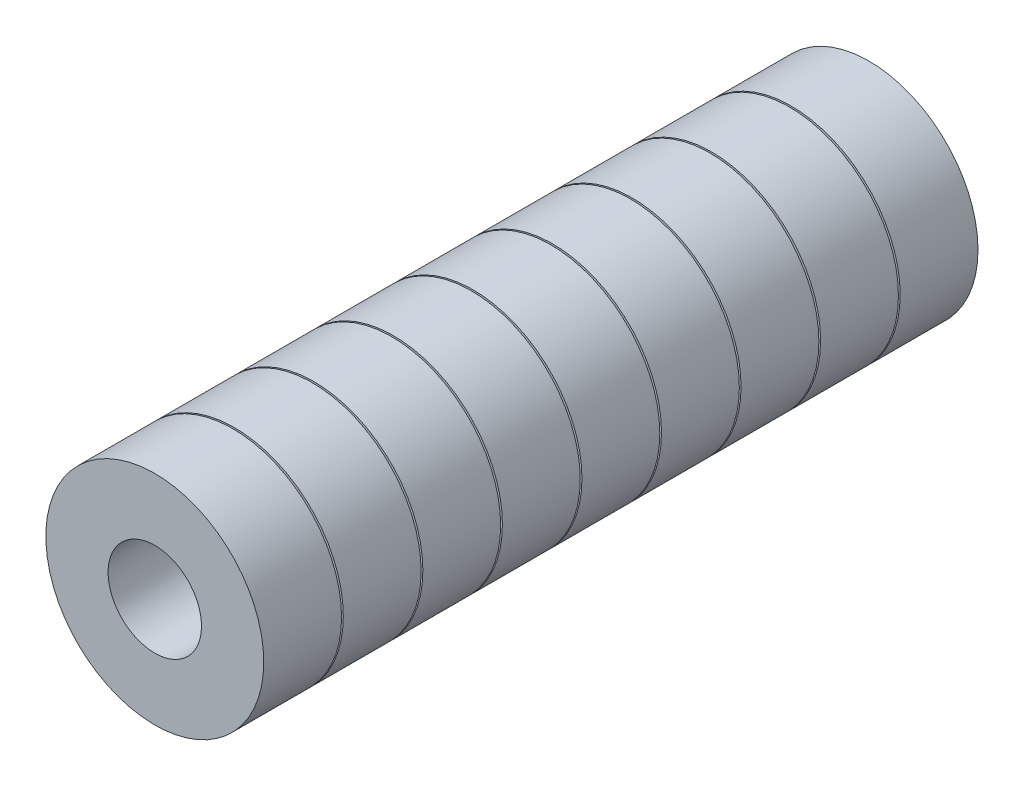
ISO-10303-21;
HEADER;
FILE_DESCRIPTION(('STEP AP214'),'2;1');
FILE_NAME('part.step','',(''),(''),'','','');
FILE_SCHEMA(('AUTOMOTIVE_DESIGN { 1 0 10303 214 1 1 1 1 }'));
ENDSEC;
DATA;
#1=APPLICATION_CONTEXT('core data for automotive mechanical design processes');
#2=APPLICATION_PROTOCOL_DEFINITION('international standard','automotive_design',2000,#1);
#3=PRODUCT_CONTEXT('',#1,'mechanical');
#4=PRODUCT('Part','Part','',(#3));
#5=PRODUCT_RELATED_PRODUCT_CATEGORY('part','',(#4));
#6=PRODUCT_DEFINITION_FORMATION('','',#4);
#7=PRODUCT_DEFINITION_CONTEXT('part definition',#1,'design');
#8=PRODUCT_DEFINITION('design','',#6,#7);
#9=PRODUCT_DEFINITION_SHAPE('','',#8);
#10=(LENGTH_UNIT() NAMED_UNIT(*) SI_UNIT(.MILLI.,.METRE.));
#11=(NAMED_UNIT(*) PLANE_ANGLE_UNIT() SI_UNIT($,.RADIAN.));
#12=(NAMED_UNIT(*) SI_UNIT($,.STERADIAN.) SOLID_ANGLE_UNIT());
#13=UNCERTAINTY_MEASURE_WITH_UNIT(LENGTH_MEASURE(1.E-05),#10,'distance_accuracy_value','');
#14=(GEOMETRIC_REPRESENTATION_CONTEXT(3) GLOBAL_UNCERTAINTY_ASSIGNED_CONTEXT((#13)) GLOBAL_UNIT_ASSIGNED_CONTEXT((#10,
#11,#12)) REPRESENTATION_CONTEXT('',''));
#15=CARTESIAN_POINT('',(0.,0.,0.));
#16=DIRECTION('',(0.,0.,1.));
#17=DIRECTION('',(1.,0.,0.));
#18=AXIS2_PLACEMENT_3D('',#15,#16,#17);
#19=CARTESIAN_POINT('',(0.,0.,-17.9444444444444));
#20=DIRECTION('',(0.,0.,1.));
#21=DIRECTION('',(1.,0.,0.));
#22=AXIS2_PLACEMENT_3D('',#19,#20,#21);
#23=PLANE('',#22);
#24=CARTESIAN_POINT('',(0.,0.,-17.9444444444444));
#25=DIRECTION('',(0.,0.,1.));
#26=DIRECTION('',(1.,0.,0.));
#27=AXIS2_PLACEMENT_3D('',#24,#25,#26);
#28=CIRCLE('',#27,3.5);
#29=CARTESIAN_POINT('',(3.5,0.,-17.9444444444444));
#30=VERTEX_POINT('',#29);
#31=EDGE_CURVE('E11',#30,#30,#28,.T.);
#32=ORIENTED_EDGE('',*,*,#31,.T.);
#33=EDGE_LOOP('',(#32));
#34=FACE_BOUND('',#33,.T.);
#35=CARTESIAN_POINT('',(0.,0.,-17.9444444444444));
#36=DIRECTION('',(0.,0.,1.));
#37=DIRECTION('',(1.,0.,0.));
#38=AXIS2_PLACEMENT_3D('',#35,#36,#37);
#39=CIRCLE('',#38,1.5);
#40=CARTESIAN_POINT('',(1.5,0.,-17.9444444444444));
#41=VERTEX_POINT('',#40);
#42=EDGE_CURVE('E59',#41,#41,#39,.T.);
#43=ORIENTED_EDGE('',*,*,#42,.F.);
#44=EDGE_LOOP('',(#43));
#45=FACE_BOUND('',#44,.T.);
#46=ADVANCED_FACE('F48',(#34,#45),#23,.T.);
#47=CARTESIAN_POINT('',(0.,0.,-20.4444444444444));
#48=DIRECTION('',(0.,0.,1.));
#49=DIRECTION('',(1.,0.,0.));
#50=AXIS2_PLACEMENT_3D('',#47,#48,#49);
#51=PLANE('',#50);
#52=CARTESIAN_POINT('',(0.,0.,-20.4444444444444));
#53=DIRECTION('',(0.,0.,1.));
#54=DIRECTION('',(1.,0.,0.));
#55=AXIS2_PLACEMENT_3D('',#52,#53,#54);
#56=CIRCLE('',#55,3.5);
#57=CARTESIAN_POINT('',(3.5,0.,-20.4444444444444));
#58=VERTEX_POINT('',#57);
#59=EDGE_CURVE('E52',#58,#58,#56,.T.);
#60=ORIENTED_EDGE('',*,*,#59,.F.);
#61=EDGE_LOOP('',(#60));
#62=FACE_BOUND('',#61,.T.);
#63=CARTESIAN_POINT('',(0.,0.,-20.4444444444444));
#64=DIRECTION('',(0.,0.,1.));
#65=DIRECTION('',(1.,0.,0.));
#66=AXIS2_PLACEMENT_3D('',#63,#64,#65);
#67=CIRCLE('',#66,1.5);
#68=CARTESIAN_POINT('',(1.5,0.,-20.4444444444444));
#69=VERTEX_POINT('',#68);
#70=EDGE_CURVE('E61',#69,#69,#67,.T.);
#71=ORIENTED_EDGE('',*,*,#70,.T.);
#72=EDGE_LOOP('',(#71));
#73=FACE_BOUND('',#72,.T.);
#74=ADVANCED_FACE('F71',(#62,#73),#51,.F.);
#75=CARTESIAN_POINT('',(0.,0.,-17.9444444444444));
#76=DIRECTION('',(0.,0.,-1.));
#77=DIRECTION('',(-1.,0.,0.));
#78=AXIS2_PLACEMENT_3D('',#75,#76,#77);
#79=CYLINDRICAL_SURFACE('',#78,3.5);
#80=ORIENTED_EDGE('',*,*,#31,.F.);
#81=EDGE_LOOP('',(#80));
#82=FACE_BOUND('',#81,.T.);
#83=ORIENTED_EDGE('',*,*,#59,.T.);
#84=EDGE_LOOP('',(#83));
#85=FACE_BOUND('',#84,.T.);
#86=ADVANCED_FACE('F50',(#82,#85),#79,.T.);
#87=CARTESIAN_POINT('',(0.,0.,-17.9444444444444));
#88=DIRECTION('',(0.,0.,-1.));
#89=DIRECTION('',(-1.,0.,0.));
#90=AXIS2_PLACEMENT_3D('',#87,#88,#89);
#91=CYLINDRICAL_SURFACE('',#90,1.5);
#92=ORIENTED_EDGE('',*,*,#42,.T.);
#93=EDGE_LOOP('',(#92));
#94=FACE_BOUND('',#93,.T.);
#95=ORIENTED_EDGE('',*,*,#70,.F.);
#96=EDGE_LOOP('',(#95));
#97=FACE_BOUND('',#96,.T.);
#98=ADVANCED_FACE('F67',(#94,#97),#91,.F.);
#99=CLOSED_SHELL('',(#46,#74,#86,#98));
#100=MANIFOLD_SOLID_BREP('B2',#99);
#101=CARTESIAN_POINT('',(0.,0.,-15.3888888888889));
#102=DIRECTION('',(0.,0.,1.));
#103=DIRECTION('',(1.,0.,0.));
#104=AXIS2_PLACEMENT_3D('',#101,#102,#103);
#105=PLANE('',#104);
#106=CARTESIAN_POINT('',(0.,0.,-15.3888888888889));
#107=DIRECTION('',(0.,0.,1.));
#108=DIRECTION('',(1.,0.,0.));
#109=AXIS2_PLACEMENT_3D('',#106,#107,#108);
#110=CIRCLE('',#109,3.5);
#111=CARTESIAN_POINT('',(3.5,0.,-15.3888888888889));
#112=VERTEX_POINT('',#111);
#113=EDGE_CURVE('E47',#112,#112,#110,.T.);
#114=ORIENTED_EDGE('',*,*,#113,.T.);
#115=EDGE_LOOP('',(#114));
#116=FACE_BOUND('',#115,.T.);
#117=CARTESIAN_POINT('',(0.,0.,-15.3888888888889));
#118=DIRECTION('',(0.,0.,1.));
#119=DIRECTION('',(1.,0.,0.));
#120=AXIS2_PLACEMENT_3D('',#117,#118,#119);
#121=CIRCLE('',#120,1.5);
#122=CARTESIAN_POINT('',(1.5,0.,-15.3888888888889));
#123=VERTEX_POINT('',#122);
#124=EDGE_CURVE('E129',#123,#123,#121,.T.);
#125=ORIENTED_EDGE('',*,*,#124,.F.);
#126=EDGE_LOOP('',(#125));
#127=FACE_BOUND('',#126,.T.);
#128=ADVANCED_FACE('F118',(#116,#127),#105,.T.);
#129=CARTESIAN_POINT('',(0.,0.,-17.8888888888889));
#130=DIRECTION('',(0.,0.,1.));
#131=DIRECTION('',(1.,0.,0.));
#132=AXIS2_PLACEMENT_3D('',#129,#130,#131);
#133=PLANE('',#132);
#134=CARTESIAN_POINT('',(0.,0.,-17.8888888888889));
#135=DIRECTION('',(0.,0.,1.));
#136=DIRECTION('',(1.,0.,0.));
#137=AXIS2_PLACEMENT_3D('',#134,#135,#136);
#138=CIRCLE('',#137,3.5);
#139=CARTESIAN_POINT('',(3.5,0.,-17.8888888888889));
#140=VERTEX_POINT('',#139);
#141=EDGE_CURVE('E122',#140,#140,#138,.T.);
#142=ORIENTED_EDGE('',*,*,#141,.F.);
#143=EDGE_LOOP('',(#142));
#144=FACE_BOUND('',#143,.T.);
#145=CARTESIAN_POINT('',(0.,0.,-17.8888888888889));
#146=DIRECTION('',(0.,0.,1.));
#147=DIRECTION('',(1.,0.,0.));
#148=AXIS2_PLACEMENT_3D('',#145,#146,#147);
#149=CIRCLE('',#148,1.5);
#150=CARTESIAN_POINT('',(1.5,0.,-17.8888888888889));
#151=VERTEX_POINT('',#150);
#152=EDGE_CURVE('E131',#151,#151,#149,.T.);
#153=ORIENTED_EDGE('',*,*,#152,.T.);
#154=EDGE_LOOP('',(#153));
#155=FACE_BOUND('',#154,.T.);
#156=ADVANCED_FACE('F141',(#144,#155),#133,.F.);
#157=CARTESIAN_POINT('',(0.,0.,-15.3888888888889));
#158=DIRECTION('',(0.,0.,-1.));
#159=DIRECTION('',(-1.,0.,0.));
#160=AXIS2_PLACEMENT_3D('',#157,#158,#159);
#161=CYLINDRICAL_SURFACE('',#160,3.5);
#162=ORIENTED_EDGE('',*,*,#113,.F.);
#163=EDGE_LOOP('',(#162));
#164=FACE_BOUND('',#163,.T.);
#165=ORIENTED_EDGE('',*,*,#141,.T.);
#166=EDGE_LOOP('',(#165));
#167=FACE_BOUND('',#166,.T.);
#168=ADVANCED_FACE('F120',(#164,#167),#161,.T.);
#169=CARTESIAN_POINT('',(0.,0.,-15.3888888888889));
#170=DIRECTION('',(0.,0.,-1.));
#171=DIRECTION('',(-1.,0.,0.));
#172=AXIS2_PLACEMENT_3D('',#169,#170,#171);
#173=CYLINDRICAL_SURFACE('',#172,1.5);
#174=ORIENTED_EDGE('',*,*,#124,.T.);
#175=EDGE_LOOP('',(#174));
#176=FACE_BOUND('',#175,.T.);
#177=ORIENTED_EDGE('',*,*,#152,.F.);
#178=EDGE_LOOP('',(#177));
#179=FACE_BOUND('',#178,.T.);
#180=ADVANCED_FACE('F137',(#176,#179),#173,.F.);
#181=CLOSED_SHELL('',(#128,#156,#168,#180));
#182=MANIFOLD_SOLID_BREP('B6',#181);
#183=CARTESIAN_POINT('',(0.,0.,-12.8333333333333));
#184=DIRECTION('',(0.,0.,1.));
#185=DIRECTION('',(1.,0.,0.));
#186=AXIS2_PLACEMENT_3D('',#183,#184,#185);
#187=PLANE('',#186);
#188=CARTESIAN_POINT('',(0.,0.,-12.8333333333333));
#189=DIRECTION('',(0.,0.,1.));
#190=DIRECTION('',(1.,0.,0.));
#191=AXIS2_PLACEMENT_3D('',#188,#189,#190);
#192=CIRCLE('',#191,3.5);
#193=CARTESIAN_POINT('',(3.5,0.,-12.8333333333333));
#194=VERTEX_POINT('',#193);
#195=EDGE_CURVE('E117',#194,#194,#192,.T.);
#196=ORIENTED_EDGE('',*,*,#195,.T.);
#197=EDGE_LOOP('',(#196));
#198=FACE_BOUND('',#197,.T.);
#199=CARTESIAN_POINT('',(0.,0.,-12.8333333333333));
#200=DIRECTION('',(0.,0.,1.));
#201=DIRECTION('',(1.,0.,0.));
#202=AXIS2_PLACEMENT_3D('',#199,#200,#201);
#203=CIRCLE('',#202,1.5);
#204=CARTESIAN_POINT('',(1.5,0.,-12.8333333333333));
#205=VERTEX_POINT('',#204);
#206=EDGE_CURVE('E199',#205,#205,#203,.T.);
#207=ORIENTED_EDGE('',*,*,#206,.F.);
#208=EDGE_LOOP('',(#207));
#209=FACE_BOUND('',#208,.T.);
#210=ADVANCED_FACE('F188',(#198,#209),#187,.T.);
#211=CARTESIAN_POINT('',(0.,0.,-15.3333333333333));
#212=DIRECTION('',(0.,0.,1.));
#213=DIRECTION('',(1.,0.,0.));
#214=AXIS2_PLACEMENT_3D('',#211,#212,#213);
#215=PLANE('',#214);
#216=CARTESIAN_POINT('',(0.,0.,-15.3333333333333));
#217=DIRECTION('',(0.,0.,1.));
#218=DIRECTION('',(1.,0.,0.));
#219=AXIS2_PLACEMENT_3D('',#216,#217,#218);
#220=CIRCLE('',#219,3.5);
#221=CARTESIAN_POINT('',(3.5,0.,-15.3333333333333));
#222=VERTEX_POINT('',#221);
#223=EDGE_CURVE('E192',#222,#222,#220,.T.);
#224=ORIENTED_EDGE('',*,*,#223,.F.);
#225=EDGE_LOOP('',(#224));
#226=FACE_BOUND('',#225,.T.);
#227=CARTESIAN_POINT('',(0.,0.,-15.3333333333333));
#228=DIRECTION('',(0.,0.,1.));
#229=DIRECTION('',(1.,0.,0.));
#230=AXIS2_PLACEMENT_3D('',#227,#228,#229);
#231=CIRCLE('',#230,1.5);
#232=CARTESIAN_POINT('',(1.5,0.,-15.3333333333333));
#233=VERTEX_POINT('',#232);
#234=EDGE_CURVE('E201',#233,#233,#231,.T.);
#235=ORIENTED_EDGE('',*,*,#234,.T.);
#236=EDGE_LOOP('',(#235));
#237=FACE_BOUND('',#236,.T.);
#238=ADVANCED_FACE('F211',(#226,#237),#215,.F.);
#239=CARTESIAN_POINT('',(0.,0.,-12.8333333333333));
#240=DIRECTION('',(0.,0.,-1.));
#241=DIRECTION('',(-1.,0.,0.));
#242=AXIS2_PLACEMENT_3D('',#239,#240,#241);
#243=CYLINDRICAL_SURFACE('',#242,3.5);
#244=ORIENTED_EDGE('',*,*,#195,.F.);
#245=EDGE_LOOP('',(#244));
#246=FACE_BOUND('',#245,.T.);
#247=ORIENTED_EDGE('',*,*,#223,.T.);
#248=EDGE_LOOP('',(#247));
#249=FACE_BOUND('',#248,.T.);
#250=ADVANCED_FACE('F190',(#246,#249),#243,.T.);
#251=CARTESIAN_POINT('',(0.,0.,-12.8333333333333));
#252=DIRECTION('',(0.,0.,-1.));
#253=DIRECTION('',(-1.,0.,0.));
#254=AXIS2_PLACEMENT_3D('',#251,#252,#253);
#255=CYLINDRICAL_SURFACE('',#254,1.5);
#256=ORIENTED_EDGE('',*,*,#206,.T.);
#257=EDGE_LOOP('',(#256));
#258=FACE_BOUND('',#257,.T.);
#259=ORIENTED_EDGE('',*,*,#234,.F.);
#260=EDGE_LOOP('',(#259));
#261=FACE_BOUND('',#260,.T.);
#262=ADVANCED_FACE('F207',(#258,#261),#255,.F.);
#263=CLOSED_SHELL('',(#210,#238,#250,#262));
#264=MANIFOLD_SOLID_BREP('B42',#263);
#265=CARTESIAN_POINT('',(0.,0.,-10.2777777777778));
#266=DIRECTION('',(0.,0.,1.));
#267=DIRECTION('',(1.,0.,0.));
#268=AXIS2_PLACEMENT_3D('',#265,#266,#267);
#269=PLANE('',#268);
#270=CARTESIAN_POINT('',(0.,0.,-10.2777777777778));
#271=DIRECTION('',(0.,0.,1.));
#272=DIRECTION('',(1.,0.,0.));
#273=AXIS2_PLACEMENT_3D('',#270,#271,#272);
#274=CIRCLE('',#273,3.5);
#275=CARTESIAN_POINT('',(3.5,0.,-10.2777777777778));
#276=VERTEX_POINT('',#275);
#277=EDGE_CURVE('E187',#276,#276,#274,.T.);
#278=ORIENTED_EDGE('',*,*,#277,.T.);
#279=EDGE_LOOP('',(#278));
#280=FACE_BOUND('',#279,.T.);
#281=CARTESIAN_POINT('',(0.,0.,-10.2777777777778));
#282=DIRECTION('',(0.,0.,1.));
#283=DIRECTION('',(1.,0.,0.));
#284=AXIS2_PLACEMENT_3D('',#281,#282,#283);
#285=CIRCLE('',#284,1.5);
#286=CARTESIAN_POINT('',(1.5,0.,-10.2777777777778));
#287=VERTEX_POINT('',#286);
#288=EDGE_CURVE('E269',#287,#287,#285,.T.);
#289=ORIENTED_EDGE('',*,*,#288,.F.);
#290=EDGE_LOOP('',(#289));
#291=FACE_BOUND('',#290,.T.);
#292=ADVANCED_FACE('F258',(#280,#291),#269,.T.);
#293=CARTESIAN_POINT('',(0.,0.,-12.7777777777778));
#294=DIRECTION('',(0.,0.,1.));
#295=DIRECTION('',(1.,0.,0.));
#296=AXIS2_PLACEMENT_3D('',#293,#294,#295);
#297=PLANE('',#296);
#298=CARTESIAN_POINT('',(0.,0.,-12.7777777777778));
#299=DIRECTION('',(0.,0.,1.));
#300=DIRECTION('',(1.,0.,0.));
#301=AXIS2_PLACEMENT_3D('',#298,#299,#300);
#302=CIRCLE('',#301,3.5);
#303=CARTESIAN_POINT('',(3.5,0.,-12.7777777777778));
#304=VERTEX_POINT('',#303);
#305=EDGE_CURVE('E262',#304,#304,#302,.T.);
#306=ORIENTED_EDGE('',*,*,#305,.F.);
#307=EDGE_LOOP('',(#306));
#308=FACE_BOUND('',#307,.T.);
#309=CARTESIAN_POINT('',(0.,0.,-12.7777777777778));
#310=DIRECTION('',(0.,0.,1.));
#311=DIRECTION('',(1.,0.,0.));
#312=AXIS2_PLACEMENT_3D('',#309,#310,#311);
#313=CIRCLE('',#312,1.5);
#314=CARTESIAN_POINT('',(1.5,0.,-12.7777777777778));
#315=VERTEX_POINT('',#314);
#316=EDGE_CURVE('E271',#315,#315,#313,.T.);
#317=ORIENTED_EDGE('',*,*,#316,.T.);
#318=EDGE_LOOP('',(#317));
#319=FACE_BOUND('',#318,.T.);
#320=ADVANCED_FACE('F281',(#308,#319),#297,.F.);
#321=CARTESIAN_POINT('',(0.,0.,-10.2777777777778));
#322=DIRECTION('',(0.,0.,-1.));
#323=DIRECTION('',(-1.,0.,0.));
#324=AXIS2_PLACEMENT_3D('',#321,#322,#323);
#325=CYLINDRICAL_SURFACE('',#324,3.5);
#326=ORIENTED_EDGE('',*,*,#277,.F.);
#327=EDGE_LOOP('',(#326));
#328=FACE_BOUND('',#327,.T.);
#329=ORIENTED_EDGE('',*,*,#305,.T.);
#330=EDGE_LOOP('',(#329));
#331=FACE_BOUND('',#330,.T.);
#332=ADVANCED_FACE('F260',(#328,#331),#325,.T.);
#333=CARTESIAN_POINT('',(0.,0.,-10.2777777777778));
#334=DIRECTION('',(0.,0.,-1.));
#335=DIRECTION('',(-1.,0.,0.));
#336=AXIS2_PLACEMENT_3D('',#333,#334,#335);
#337=CYLINDRICAL_SURFACE('',#336,1.5);
#338=ORIENTED_EDGE('',*,*,#288,.T.);
#339=EDGE_LOOP('',(#338));
#340=FACE_BOUND('',#339,.T.);
#341=ORIENTED_EDGE('',*,*,#316,.F.);
#342=EDGE_LOOP('',(#341));
#343=FACE_BOUND('',#342,.T.);
#344=ADVANCED_FACE('F277',(#340,#343),#337,.F.);
#345=CLOSED_SHELL('',(#292,#320,#332,#344));
#346=MANIFOLD_SOLID_BREP('B112',#345);
#347=CARTESIAN_POINT('',(0.,0.,-7.72222222222222));
#348=DIRECTION('',(0.,0.,1.));
#349=DIRECTION('',(1.,0.,0.));
#350=AXIS2_PLACEMENT_3D('',#347,#348,#349);
#351=PLANE('',#350);
#352=CARTESIAN_POINT('',(0.,0.,-7.72222222222222));
#353=DIRECTION('',(0.,0.,1.));
#354=DIRECTION('',(1.,0.,0.));
#355=AXIS2_PLACEMENT_3D('',#352,#353,#354);
#356=CIRCLE('',#355,3.5);
#357=CARTESIAN_POINT('',(3.5,0.,-7.72222222222222));
#358=VERTEX_POINT('',#357);
#359=EDGE_CURVE('E257',#358,#358,#356,.T.);
#360=ORIENTED_EDGE('',*,*,#359,.T.);
#361=EDGE_LOOP('',(#360));
#362=FACE_BOUND('',#361,.T.);
#363=CARTESIAN_POINT('',(0.,0.,-7.72222222222222));
#364=DIRECTION('',(0.,0.,1.));
#365=DIRECTION('',(1.,0.,0.));
#366=AXIS2_PLACEMENT_3D('',#363,#364,#365);
#367=CIRCLE('',#366,1.5);
#368=CARTESIAN_POINT('',(1.5,0.,-7.72222222222222));
#369=VERTEX_POINT('',#368);
#370=EDGE_CURVE('E339',#369,#369,#367,.T.);
#371=ORIENTED_EDGE('',*,*,#370,.F.);
#372=EDGE_LOOP('',(#371));
#373=FACE_BOUND('',#372,.T.);
#374=ADVANCED_FACE('F328',(#362,#373),#351,.T.);
#375=CARTESIAN_POINT('',(0.,0.,-10.2222222222222));
#376=DIRECTION('',(0.,0.,1.));
#377=DIRECTION('',(1.,0.,0.));
#378=AXIS2_PLACEMENT_3D('',#375,#376,#377);
#379=PLANE('',#378);
#380=CARTESIAN_POINT('',(0.,0.,-10.2222222222222));
#381=DIRECTION('',(0.,0.,1.));
#382=DIRECTION('',(1.,0.,0.));
#383=AXIS2_PLACEMENT_3D('',#380,#381,#382);
#384=CIRCLE('',#383,3.5);
#385=CARTESIAN_POINT('',(3.5,0.,-10.2222222222222));
#386=VERTEX_POINT('',#385);
#387=EDGE_CURVE('E332',#386,#386,#384,.T.);
#388=ORIENTED_EDGE('',*,*,#387,.F.);
#389=EDGE_LOOP('',(#388));
#390=FACE_BOUND('',#389,.T.);
#391=CARTESIAN_POINT('',(0.,0.,-10.2222222222222));
#392=DIRECTION('',(0.,0.,1.));
#393=DIRECTION('',(1.,0.,0.));
#394=AXIS2_PLACEMENT_3D('',#391,#392,#393);
#395=CIRCLE('',#394,1.5);
#396=CARTESIAN_POINT('',(1.5,0.,-10.2222222222222));
#397=VERTEX_POINT('',#396);
#398=EDGE_CURVE('E341',#397,#397,#395,.T.);
#399=ORIENTED_EDGE('',*,*,#398,.T.);
#400=EDGE_LOOP('',(#399));
#401=FACE_BOUND('',#400,.T.);
#402=ADVANCED_FACE('F351',(#390,#401),#379,.F.);
#403=CARTESIAN_POINT('',(0.,0.,-7.72222222222222));
#404=DIRECTION('',(0.,0.,-1.));
#405=DIRECTION('',(-1.,0.,0.));
#406=AXIS2_PLACEMENT_3D('',#403,#404,#405);
#407=CYLINDRICAL_SURFACE('',#406,3.5);
#408=ORIENTED_EDGE('',*,*,#359,.F.);
#409=EDGE_LOOP('',(#408));
#410=FACE_BOUND('',#409,.T.);
#411=ORIENTED_EDGE('',*,*,#387,.T.);
#412=EDGE_LOOP('',(#411));
#413=FACE_BOUND('',#412,.T.);
#414=ADVANCED_FACE('F330',(#410,#413),#407,.T.);
#415=CARTESIAN_POINT('',(0.,0.,-7.72222222222222));
#416=DIRECTION('',(0.,0.,-1.));
#417=DIRECTION('',(-1.,0.,0.));
#418=AXIS2_PLACEMENT_3D('',#415,#416,#417);
#419=CYLINDRICAL_SURFACE('',#418,1.5);
#420=ORIENTED_EDGE('',*,*,#370,.T.);
#421=EDGE_LOOP('',(#420));
#422=FACE_BOUND('',#421,.T.);
#423=ORIENTED_EDGE('',*,*,#398,.F.);
#424=EDGE_LOOP('',(#423));
#425=FACE_BOUND('',#424,.T.);
#426=ADVANCED_FACE('F347',(#422,#425),#419,.F.);
#427=CLOSED_SHELL('',(#374,#402,#414,#426));
#428=MANIFOLD_SOLID_BREP('B182',#427);
#429=CARTESIAN_POINT('',(0.,0.,-5.16666666666667));
#430=DIRECTION('',(0.,0.,1.));
#431=DIRECTION('',(1.,0.,0.));
#432=AXIS2_PLACEMENT_3D('',#429,#430,#431);
#433=PLANE('',#432);
#434=CARTESIAN_POINT('',(0.,0.,-5.16666666666667));
#435=DIRECTION('',(0.,0.,1.));
#436=DIRECTION('',(1.,0.,0.));
#437=AXIS2_PLACEMENT_3D('',#434,#435,#436);
#438=CIRCLE('',#437,3.5);
#439=CARTESIAN_POINT('',(3.5,0.,-5.16666666666667));
#440=VERTEX_POINT('',#439);
#441=EDGE_CURVE('E327',#440,#440,#438,.T.);
#442=ORIENTED_EDGE('',*,*,#441,.T.);
#443=EDGE_LOOP('',(#442));
#444=FACE_BOUND('',#443,.T.);
#445=CARTESIAN_POINT('',(0.,0.,-5.16666666666667));
#446=DIRECTION('',(0.,0.,1.));
#447=DIRECTION('',(1.,0.,0.));
#448=AXIS2_PLACEMENT_3D('',#445,#446,#447);
#449=CIRCLE('',#448,1.5);
#450=CARTESIAN_POINT('',(1.5,0.,-5.16666666666667));
#451=VERTEX_POINT('',#450);
#452=EDGE_CURVE('E409',#451,#451,#449,.T.);
#453=ORIENTED_EDGE('',*,*,#452,.F.);
#454=EDGE_LOOP('',(#453));
#455=FACE_BOUND('',#454,.T.);
#456=ADVANCED_FACE('F398',(#444,#455),#433,.T.);
#457=CARTESIAN_POINT('',(0.,0.,-7.66666666666667));
#458=DIRECTION('',(0.,0.,1.));
#459=DIRECTION('',(1.,0.,0.));
#460=AXIS2_PLACEMENT_3D('',#457,#458,#459);
#461=PLANE('',#460);
#462=CARTESIAN_POINT('',(0.,0.,-7.66666666666667));
#463=DIRECTION('',(0.,0.,1.));
#464=DIRECTION('',(1.,0.,0.));
#465=AXIS2_PLACEMENT_3D('',#462,#463,#464);
#466=CIRCLE('',#465,3.5);
#467=CARTESIAN_POINT('',(3.5,0.,-7.66666666666667));
#468=VERTEX_POINT('',#467);
#469=EDGE_CURVE('E402',#468,#468,#466,.T.);
#470=ORIENTED_EDGE('',*,*,#469,.F.);
#471=EDGE_LOOP('',(#470));
#472=FACE_BOUND('',#471,.T.);
#473=CARTESIAN_POINT('',(0.,0.,-7.66666666666667));
#474=DIRECTION('',(0.,0.,1.));
#475=DIRECTION('',(1.,0.,0.));
#476=AXIS2_PLACEMENT_3D('',#473,#474,#475);
#477=CIRCLE('',#476,1.5);
#478=CARTESIAN_POINT('',(1.5,0.,-7.66666666666667));
#479=VERTEX_POINT('',#478);
#480=EDGE_CURVE('E411',#479,#479,#477,.T.);
#481=ORIENTED_EDGE('',*,*,#480,.T.);
#482=EDGE_LOOP('',(#481));
#483=FACE_BOUND('',#482,.T.);
#484=ADVANCED_FACE('F421',(#472,#483),#461,.F.);
#485=CARTESIAN_POINT('',(0.,0.,-5.16666666666667));
#486=DIRECTION('',(0.,0.,-1.));
#487=DIRECTION('',(-1.,0.,0.));
#488=AXIS2_PLACEMENT_3D('',#485,#486,#487);
#489=CYLINDRICAL_SURFACE('',#488,3.5);
#490=ORIENTED_EDGE('',*,*,#441,.F.);
#491=EDGE_LOOP('',(#490));
#492=FACE_BOUND('',#491,.T.);
#493=ORIENTED_EDGE('',*,*,#469,.T.);
#494=EDGE_LOOP('',(#493));
#495=FACE_BOUND('',#494,.T.);
#496=ADVANCED_FACE('F400',(#492,#495),#489,.T.);
#497=CARTESIAN_POINT('',(0.,0.,-5.16666666666667));
#498=DIRECTION('',(0.,0.,-1.));
#499=DIRECTION('',(-1.,0.,0.));
#500=AXIS2_PLACEMENT_3D('',#497,#498,#499);
#501=CYLINDRICAL_SURFACE('',#500,1.5);
#502=ORIENTED_EDGE('',*,*,#452,.T.);
#503=EDGE_LOOP('',(#502));
#504=FACE_BOUND('',#503,.T.);
#505=ORIENTED_EDGE('',*,*,#480,.F.);
#506=EDGE_LOOP('',(#505));
#507=FACE_BOUND('',#506,.T.);
#508=ADVANCED_FACE('F417',(#504,#507),#501,.F.);
#509=CLOSED_SHELL('',(#456,#484,#496,#508));
#510=MANIFOLD_SOLID_BREP('B252',#509);
#511=CARTESIAN_POINT('',(0.,0.,-2.61111111111111));
#512=DIRECTION('',(0.,0.,1.));
#513=DIRECTION('',(1.,0.,0.));
#514=AXIS2_PLACEMENT_3D('',#511,#512,#513);
#515=PLANE('',#514);
#516=CARTESIAN_POINT('',(0.,0.,-2.61111111111111));
#517=DIRECTION('',(0.,0.,1.));
#518=DIRECTION('',(1.,0.,0.));
#519=AXIS2_PLACEMENT_3D('',#516,#517,#518);
#520=CIRCLE('',#519,3.5);
#521=CARTESIAN_POINT('',(3.5,0.,-2.61111111111111));
#522=VERTEX_POINT('',#521);
#523=EDGE_CURVE('E397',#522,#522,#520,.T.);
#524=ORIENTED_EDGE('',*,*,#523,.T.);
#525=EDGE_LOOP('',(#524));
#526=FACE_BOUND('',#525,.T.);
#527=CARTESIAN_POINT('',(0.,0.,-2.61111111111111));
#528=DIRECTION('',(0.,0.,1.));
#529=DIRECTION('',(1.,0.,0.));
#530=AXIS2_PLACEMENT_3D('',#527,#528,#529);
#531=CIRCLE('',#530,1.5);
#532=CARTESIAN_POINT('',(1.5,0.,-2.61111111111111));
#533=VERTEX_POINT('',#532);
#534=EDGE_CURVE('E479',#533,#533,#531,.T.);
#535=ORIENTED_EDGE('',*,*,#534,.F.);
#536=EDGE_LOOP('',(#535));
#537=FACE_BOUND('',#536,.T.);
#538=ADVANCED_FACE('F468',(#526,#537),#515,.T.);
#539=CARTESIAN_POINT('',(0.,0.,-5.11111111111111));
#540=DIRECTION('',(0.,0.,1.));
#541=DIRECTION('',(1.,0.,0.));
#542=AXIS2_PLACEMENT_3D('',#539,#540,#541);
#543=PLANE('',#542);
#544=CARTESIAN_POINT('',(0.,0.,-5.11111111111111));
#545=DIRECTION('',(0.,0.,1.));
#546=DIRECTION('',(1.,0.,0.));
#547=AXIS2_PLACEMENT_3D('',#544,#545,#546);
#548=CIRCLE('',#547,3.5);
#549=CARTESIAN_POINT('',(3.5,0.,-5.11111111111111));
#550=VERTEX_POINT('',#549);
#551=EDGE_CURVE('E472',#550,#550,#548,.T.);
#552=ORIENTED_EDGE('',*,*,#551,.F.);
#553=EDGE_LOOP('',(#552));
#554=FACE_BOUND('',#553,.T.);
#555=CARTESIAN_POINT('',(0.,0.,-5.11111111111111));
#556=DIRECTION('',(0.,0.,1.));
#557=DIRECTION('',(1.,0.,0.));
#558=AXIS2_PLACEMENT_3D('',#555,#556,#557);
#559=CIRCLE('',#558,1.5);
#560=CARTESIAN_POINT('',(1.5,0.,-5.11111111111111));
#561=VERTEX_POINT('',#560);
#562=EDGE_CURVE('E481',#561,#561,#559,.T.);
#563=ORIENTED_EDGE('',*,*,#562,.T.);
#564=EDGE_LOOP('',(#563));
#565=FACE_BOUND('',#564,.T.);
#566=ADVANCED_FACE('F491',(#554,#565),#543,.F.);
#567=CARTESIAN_POINT('',(0.,0.,-2.61111111111111));
#568=DIRECTION('',(0.,0.,-1.));
#569=DIRECTION('',(-1.,0.,0.));
#570=AXIS2_PLACEMENT_3D('',#567,#568,#569);
#571=CYLINDRICAL_SURFACE('',#570,3.5);
#572=ORIENTED_EDGE('',*,*,#523,.F.);
#573=EDGE_LOOP('',(#572));
#574=FACE_BOUND('',#573,.T.);
#575=ORIENTED_EDGE('',*,*,#551,.T.);
#576=EDGE_LOOP('',(#575));
#577=FACE_BOUND('',#576,.T.);
#578=ADVANCED_FACE('F470',(#574,#577),#571,.T.);
#579=CARTESIAN_POINT('',(0.,0.,-2.61111111111111));
#580=DIRECTION('',(0.,0.,-1.));
#581=DIRECTION('',(-1.,0.,0.));
#582=AXIS2_PLACEMENT_3D('',#579,#580,#581);
#583=CYLINDRICAL_SURFACE('',#582,1.5);
#584=ORIENTED_EDGE('',*,*,#534,.T.);
#585=EDGE_LOOP('',(#584));
#586=FACE_BOUND('',#585,.T.);
#587=ORIENTED_EDGE('',*,*,#562,.F.);
#588=EDGE_LOOP('',(#587));
#589=FACE_BOUND('',#588,.T.);
#590=ADVANCED_FACE('F487',(#586,#589),#583,.F.);
#591=CLOSED_SHELL('',(#538,#566,#578,#590));
#592=MANIFOLD_SOLID_BREP('B322',#591);
#593=CARTESIAN_POINT('',(0.,0.,-0.0555555555555552));
#594=DIRECTION('',(0.,0.,1.));
#595=DIRECTION('',(1.,0.,0.));
#596=AXIS2_PLACEMENT_3D('',#593,#594,#595);
#597=PLANE('',#596);
#598=CARTESIAN_POINT('',(0.,0.,-0.0555555555555552));
#599=DIRECTION('',(0.,0.,1.));
#600=DIRECTION('',(1.,0.,0.));
#601=AXIS2_PLACEMENT_3D('',#598,#599,#600);
#602=CIRCLE('',#601,3.5);
#603=CARTESIAN_POINT('',(3.5,0.,-0.0555555555555552));
#604=VERTEX_POINT('',#603);
#605=EDGE_CURVE('E467',#604,#604,#602,.T.);
#606=ORIENTED_EDGE('',*,*,#605,.T.);
#607=EDGE_LOOP('',(#606));
#608=FACE_BOUND('',#607,.T.);
#609=CARTESIAN_POINT('',(0.,0.,-0.0555555555555552));
#610=DIRECTION('',(0.,0.,1.));
#611=DIRECTION('',(1.,0.,0.));
#612=AXIS2_PLACEMENT_3D('',#609,#610,#611);
#613=CIRCLE('',#612,1.5);
#614=CARTESIAN_POINT('',(1.5,0.,-0.0555555555555552));
#615=VERTEX_POINT('',#614);
#616=EDGE_CURVE('E548',#615,#615,#613,.T.);
#617=ORIENTED_EDGE('',*,*,#616,.F.);
#618=EDGE_LOOP('',(#617));
#619=FACE_BOUND('',#618,.T.);
#620=ADVANCED_FACE('F537',(#608,#619),#597,.T.);
#621=CARTESIAN_POINT('',(0.,0.,-2.55555555555556));
#622=DIRECTION('',(0.,0.,1.));
#623=DIRECTION('',(1.,0.,0.));
#624=AXIS2_PLACEMENT_3D('',#621,#622,#623);
#625=PLANE('',#624);
#626=CARTESIAN_POINT('',(0.,0.,-2.55555555555556));
#627=DIRECTION('',(0.,0.,1.));
#628=DIRECTION('',(1.,0.,0.));
#629=AXIS2_PLACEMENT_3D('',#626,#627,#628);
#630=CIRCLE('',#629,3.5);
#631=CARTESIAN_POINT('',(3.5,0.,-2.55555555555556));
#632=VERTEX_POINT('',#631);
#633=EDGE_CURVE('E541',#632,#632,#630,.T.);
#634=ORIENTED_EDGE('',*,*,#633,.F.);
#635=EDGE_LOOP('',(#634));
#636=FACE_BOUND('',#635,.T.);
#637=CARTESIAN_POINT('',(0.,0.,-2.55555555555556));
#638=DIRECTION('',(0.,0.,1.));
#639=DIRECTION('',(1.,0.,0.));
#640=AXIS2_PLACEMENT_3D('',#637,#638,#639);
#641=CIRCLE('',#640,1.5);
#642=CARTESIAN_POINT('',(1.5,0.,-2.55555555555556));
#643=VERTEX_POINT('',#642);
#644=EDGE_CURVE('E550',#643,#643,#641,.T.);
#645=ORIENTED_EDGE('',*,*,#644,.T.);
#646=EDGE_LOOP('',(#645));
#647=FACE_BOUND('',#646,.T.);
#648=ADVANCED_FACE('F560',(#636,#647),#625,.F.);
#649=CARTESIAN_POINT('',(0.,0.,-0.0555555555555552));
#650=DIRECTION('',(0.,0.,-1.));
#651=DIRECTION('',(-1.,0.,0.));
#652=AXIS2_PLACEMENT_3D('',#649,#650,#651);
#653=CYLINDRICAL_SURFACE('',#652,3.5);
#654=ORIENTED_EDGE('',*,*,#605,.F.);
#655=EDGE_LOOP('',(#654));
#656=FACE_BOUND('',#655,.T.);
#657=ORIENTED_EDGE('',*,*,#633,.T.);
#658=EDGE_LOOP('',(#657));
#659=FACE_BOUND('',#658,.T.);
#660=ADVANCED_FACE('F539',(#656,#659),#653,.T.);
#661=CARTESIAN_POINT('',(0.,0.,-0.0555555555555552));
#662=DIRECTION('',(0.,0.,-1.));
#663=DIRECTION('',(-1.,0.,0.));
#664=AXIS2_PLACEMENT_3D('',#661,#662,#663);
#665=CYLINDRICAL_SURFACE('',#664,1.5);
#666=ORIENTED_EDGE('',*,*,#616,.T.);
#667=EDGE_LOOP('',(#666));
#668=FACE_BOUND('',#667,.T.);
#669=ORIENTED_EDGE('',*,*,#644,.F.);
#670=EDGE_LOOP('',(#669));
#671=FACE_BOUND('',#670,.T.);
#672=ADVANCED_FACE('F556',(#668,#671),#665,.F.);
#673=CLOSED_SHELL('',(#620,#648,#660,#672));
#674=MANIFOLD_SOLID_BREP('B392',#673);
#675=CARTESIAN_POINT('',(0.,0.,2.5));
#676=DIRECTION('',(0.,0.,1.));
#677=DIRECTION('',(1.,0.,0.));
#678=AXIS2_PLACEMENT_3D('',#675,#676,#677);
#679=PLANE('',#678);
#680=CARTESIAN_POINT('',(0.,0.,2.5));
#681=DIRECTION('',(0.,0.,1.));
#682=DIRECTION('',(1.,0.,0.));
#683=AXIS2_PLACEMENT_3D('',#680,#681,#682);
#684=CIRCLE('',#683,3.5);
#685=CARTESIAN_POINT('',(3.5,0.,2.5));
#686=VERTEX_POINT('',#685);
#687=EDGE_CURVE('E536',#686,#686,#684,.T.);
#688=ORIENTED_EDGE('',*,*,#687,.T.);
#689=EDGE_LOOP('',(#688));
#690=FACE_BOUND('',#689,.T.);
#691=CARTESIAN_POINT('',(0.,0.,2.5));
#692=DIRECTION('',(0.,0.,1.));
#693=DIRECTION('',(1.,0.,0.));
#694=AXIS2_PLACEMENT_3D('',#691,#692,#693);
#695=CIRCLE('',#694,1.5);
#696=CARTESIAN_POINT('',(1.5,0.,2.5));
#697=VERTEX_POINT('',#696);
#698=EDGE_CURVE('E610',#697,#697,#695,.T.);
#699=ORIENTED_EDGE('',*,*,#698,.F.);
#700=EDGE_LOOP('',(#699));
#701=FACE_BOUND('',#700,.T.);
#702=ADVANCED_FACE('F599',(#690,#701),#679,.T.);
#703=CARTESIAN_POINT('',(0.,0.,0.));
#704=DIRECTION('',(0.,0.,1.));
#705=DIRECTION('',(1.,0.,0.));
#706=AXIS2_PLACEMENT_3D('',#703,#704,#705);
#707=PLANE('',#706);
#708=CARTESIAN_POINT('',(0.,0.,0.));
#709=DIRECTION('',(0.,0.,1.));
#710=DIRECTION('',(1.,0.,0.));
#711=AXIS2_PLACEMENT_3D('',#708,#709,#710);
#712=CIRCLE('',#711,3.5);
#713=CARTESIAN_POINT('',(3.5,0.,0.));
#714=VERTEX_POINT('',#713);
#715=EDGE_CURVE('E603',#714,#714,#712,.T.);
#716=ORIENTED_EDGE('',*,*,#715,.F.);
#717=EDGE_LOOP('',(#716));
#718=FACE_BOUND('',#717,.T.);
#719=CARTESIAN_POINT('',(0.,0.,0.));
#720=DIRECTION('',(0.,0.,1.));
#721=DIRECTION('',(1.,0.,0.));
#722=AXIS2_PLACEMENT_3D('',#719,#720,#721);
#723=CIRCLE('',#722,1.5);
#724=CARTESIAN_POINT('',(1.5,0.,0.));
#725=VERTEX_POINT('',#724);
#726=EDGE_CURVE('E612',#725,#725,#723,.T.);
#727=ORIENTED_EDGE('',*,*,#726,.T.);
#728=EDGE_LOOP('',(#727));
#729=FACE_BOUND('',#728,.T.);
#730=ADVANCED_FACE('F622',(#718,#729),#707,.F.);
#731=CARTESIAN_POINT('',(0.,0.,2.5));
#732=DIRECTION('',(0.,0.,-1.));
#733=DIRECTION('',(-1.,0.,0.));
#734=AXIS2_PLACEMENT_3D('',#731,#732,#733);
#735=CYLINDRICAL_SURFACE('',#734,3.5);
#736=ORIENTED_EDGE('',*,*,#687,.F.);
#737=EDGE_LOOP('',(#736));
#738=FACE_BOUND('',#737,.T.);
#739=ORIENTED_EDGE('',*,*,#715,.T.);
#740=EDGE_LOOP('',(#739));
#741=FACE_BOUND('',#740,.T.);
#742=ADVANCED_FACE('F601',(#738,#741),#735,.T.);
#743=CARTESIAN_POINT('',(0.,0.,2.5));
#744=DIRECTION('',(0.,0.,-1.));
#745=DIRECTION('',(-1.,0.,0.));
#746=AXIS2_PLACEMENT_3D('',#743,#744,#745);
#747=CYLINDRICAL_SURFACE('',#746,1.5);
#748=ORIENTED_EDGE('',*,*,#698,.T.);
#749=EDGE_LOOP('',(#748));
#750=FACE_BOUND('',#749,.T.);
#751=ORIENTED_EDGE('',*,*,#726,.F.);
#752=EDGE_LOOP('',(#751));
#753=FACE_BOUND('',#752,.T.);
#754=ADVANCED_FACE('F618',(#750,#753),#747,.F.);
#755=CLOSED_SHELL('',(#702,#730,#742,#754));
#756=MANIFOLD_SOLID_BREP('B462',#755);
#757=ADVANCED_BREP_SHAPE_REPRESENTATION('',(#18,#100,#182,#264,#346,#428,#510,#592,#674,#756),#14);
#758=SHAPE_DEFINITION_REPRESENTATION(#9,#757);
ENDSEC;
END-ISO-10303-21;
